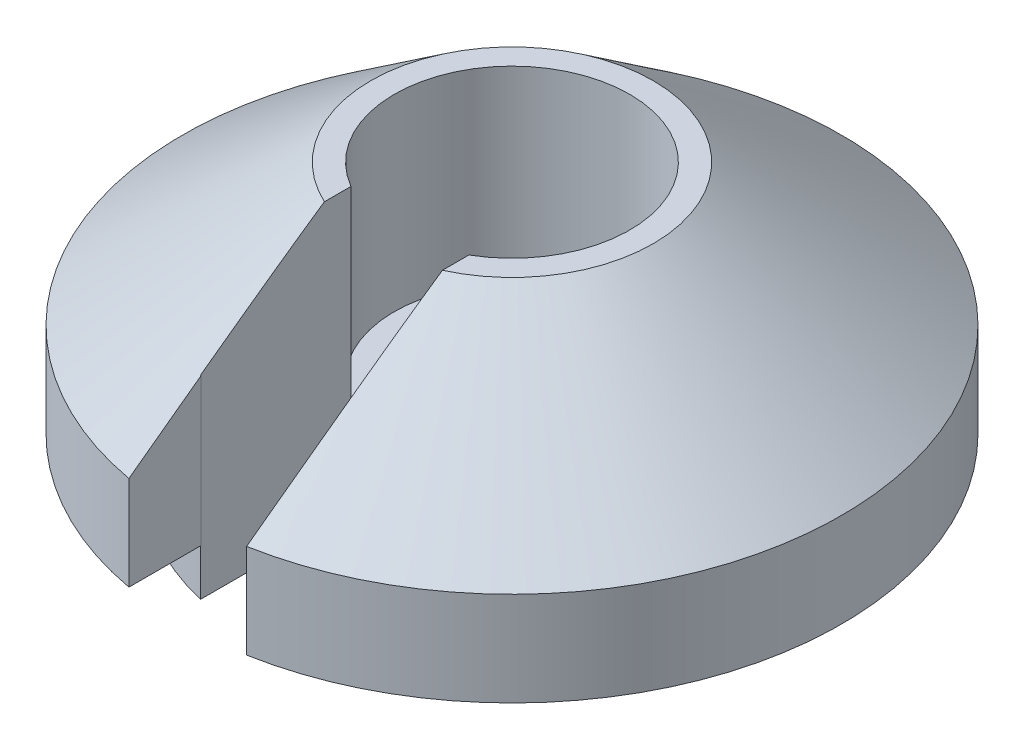
ISO-10303-21;
HEADER;
FILE_DESCRIPTION(('STEP AP214'),'2;1');
FILE_NAME('part.step','',(''),(''),'','','');
FILE_SCHEMA(('AUTOMOTIVE_DESIGN { 1 0 10303 214 1 1 1 1 }'));
ENDSEC;
DATA;
#1=APPLICATION_CONTEXT('core data for automotive mechanical design processes');
#2=APPLICATION_PROTOCOL_DEFINITION('international standard','automotive_design',2000,#1);
#3=PRODUCT_CONTEXT('',#1,'mechanical');
#4=PRODUCT('Part','Part','',(#3));
#5=PRODUCT_RELATED_PRODUCT_CATEGORY('part','',(#4));
#6=PRODUCT_DEFINITION_FORMATION('','',#4);
#7=PRODUCT_DEFINITION_CONTEXT('part definition',#1,'design');
#8=PRODUCT_DEFINITION('design','',#6,#7);
#9=PRODUCT_DEFINITION_SHAPE('','',#8);
#10=(LENGTH_UNIT() NAMED_UNIT(*) SI_UNIT(.MILLI.,.METRE.));
#11=(NAMED_UNIT(*) PLANE_ANGLE_UNIT() SI_UNIT($,.RADIAN.));
#12=(NAMED_UNIT(*) SI_UNIT($,.STERADIAN.) SOLID_ANGLE_UNIT());
#13=UNCERTAINTY_MEASURE_WITH_UNIT(LENGTH_MEASURE(1.E-05),#10,'distance_accuracy_value','');
#14=(GEOMETRIC_REPRESENTATION_CONTEXT(3) GLOBAL_UNCERTAINTY_ASSIGNED_CONTEXT((#13)) GLOBAL_UNIT_ASSIGNED_CONTEXT((#10,
#11,#12)) REPRESENTATION_CONTEXT('',''));
#15=CARTESIAN_POINT('',(0.,0.,0.));
#16=DIRECTION('',(0.,0.,1.));
#17=DIRECTION('',(1.,0.,0.));
#18=AXIS2_PLACEMENT_3D('',#15,#16,#17);
#19=CARTESIAN_POINT('',(0.,0.,0.));
#20=DIRECTION('',(0.,1.,0.));
#21=DIRECTION('',(-1.,0.,0.));
#22=AXIS2_PLACEMENT_3D('',#19,#20,#21);
#23=PLANE('',#22);
#24=DIRECTION('',(1.,0.,0.));
#25=VECTOR('',#24,1.);
#26=CARTESIAN_POINT('',(1.25,0.,-0.393928678592862));
#27=LINE('',#26,#25);
#28=CARTESIAN_POINT('',(1.24164617220011,0.,-0.393928678592862));
#29=VERTEX_POINT('',#28);
#30=CARTESIAN_POINT('',(1.25,0.,-0.393928678592862));
#31=VERTEX_POINT('',#30);
#32=EDGE_CURVE('E146',#29,#31,#27,.T.);
#33=ORIENTED_EDGE('',*,*,#32,.F.);
#34=CARTESIAN_POINT('',(-0.00739357909636663,0.,-0.393928678592863));
#35=DIRECTION('',(0.,-1.,0.));
#36=DIRECTION('',(1.,0.,0.));
#37=AXIS2_PLACEMENT_3D('',#34,#35,#36);
#38=CIRCLE('',#37,1.24903975129648);
#39=CARTESIAN_POINT('',(-1.25643333039284,0.,-0.393928678592863));
#40=VERTEX_POINT('',#39);
#41=EDGE_CURVE('E54',#40,#29,#38,.T.);
#42=ORIENTED_EDGE('',*,*,#41,.F.);
#43=CARTESIAN_POINT('',(-1.26478715819273,0.,-0.393928678592863));
#44=VERTEX_POINT('',#43);
#45=EDGE_CURVE('E145',#44,#40,#27,.T.);
#46=ORIENTED_EDGE('',*,*,#45,.F.);
#47=DIRECTION('',(0.,0.,-1.));
#48=VECTOR('',#47,1.);
#49=CARTESIAN_POINT('',(-1.26478715819273,0.,5.35607132140714));
#50=LINE('',#49,#48);
#51=CARTESIAN_POINT('',(-1.26478715819273,0.,5.35259875616235));
#52=VERTEX_POINT('',#51);
#53=EDGE_CURVE('E139',#52,#44,#50,.T.);
#54=ORIENTED_EDGE('',*,*,#53,.F.);
#55=CARTESIAN_POINT('',(0.,0.,0.));
#56=DIRECTION('',(0.,1.,0.));
#57=DIRECTION('',(-1.,0.,0.));
#58=AXIS2_PLACEMENT_3D('',#55,#56,#57);
#59=CIRCLE('',#58,5.5);
#60=CARTESIAN_POINT('',(1.25,0.,5.35607132140714));
#61=VERTEX_POINT('',#60);
#62=EDGE_CURVE('E290',#61,#52,#59,.T.);
#63=ORIENTED_EDGE('',*,*,#62,.F.);
#64=DIRECTION('',(0.,0.,1.));
#65=VECTOR('',#64,1.);
#66=CARTESIAN_POINT('',(1.25,0.,0.));
#67=LINE('',#66,#65);
#68=EDGE_CURVE('E61',#31,#61,#67,.T.);
#69=ORIENTED_EDGE('',*,*,#68,.F.);
#70=EDGE_LOOP('',(#33,#42,#46,#54,#63,#69));
#71=FACE_BOUND('',#70,.T.);
#72=ADVANCED_FACE('F40',(#71),#23,.F.);
#73=CARTESIAN_POINT('',(0.,6.,0.));
#74=DIRECTION('',(0.,1.,0.));
#75=DIRECTION('',(-1.,0.,0.));
#76=AXIS2_PLACEMENT_3D('',#73,#74,#75);
#77=CYLINDRICAL_SURFACE('',#76,5.5);
#78=ORIENTED_EDGE('',*,*,#62,.T.);
#79=DIRECTION('',(0.,1.,0.));
#80=VECTOR('',#79,1.);
#81=CARTESIAN_POINT('',(-1.26478715819274,6.,5.35259875616235));
#82=LINE('',#81,#80);
#83=CARTESIAN_POINT('',(-1.26478715819273,1.,5.35259875616235));
#84=VERTEX_POINT('',#83);
#85=EDGE_CURVE('E209',#52,#84,#82,.T.);
#86=ORIENTED_EDGE('',*,*,#85,.T.);
#87=CARTESIAN_POINT('',(0.,1.,0.));
#88=DIRECTION('',(0.,1.,0.));
#89=DIRECTION('',(-1.,0.,0.));
#90=AXIS2_PLACEMENT_3D('',#87,#88,#89);
#91=CIRCLE('',#90,5.5);
#92=CARTESIAN_POINT('',(1.25,1.,5.35607132140714));
#93=VERTEX_POINT('',#92);
#94=EDGE_CURVE('E288',#93,#84,#91,.T.);
#95=ORIENTED_EDGE('',*,*,#94,.F.);
#96=DIRECTION('',(0.,1.,0.));
#97=VECTOR('',#96,1.);
#98=CARTESIAN_POINT('',(1.25,6.,5.35607132140714));
#99=LINE('',#98,#97);
#100=EDGE_CURVE('E313',#61,#93,#99,.T.);
#101=ORIENTED_EDGE('',*,*,#100,.F.);
#102=EDGE_LOOP('',(#78,#86,#95,#101));
#103=FACE_BOUND('',#102,.T.);
#104=ADVANCED_FACE('F257',(#103),#77,.T.);
#105=CARTESIAN_POINT('',(5.5,1.,0.));
#106=DIRECTION('',(0.,1.,0.));
#107=DIRECTION('',(-1.,0.,0.));
#108=AXIS2_PLACEMENT_3D('',#105,#106,#107);
#109=PLANE('',#108);
#110=DIRECTION('',(0.,0.,1.));
#111=VECTOR('',#110,1.);
#112=CARTESIAN_POINT('',(-1.26478715819273,1.,0.));
#113=LINE('',#112,#111);
#114=CARTESIAN_POINT('',(-1.26478715819274,0.999999999999999,5.35607132140714));
#115=VERTEX_POINT('',#114);
#116=EDGE_CURVE('E179',#84,#115,#113,.T.);
#117=ORIENTED_EDGE('',*,*,#116,.T.);
#118=DIRECTION('',(1.,0.,0.));
#119=VECTOR('',#118,1.);
#120=CARTESIAN_POINT('',(5.5,1.,5.35607132140714));
#121=LINE('',#120,#119);
#122=CARTESIAN_POINT('',(-1.25,0.999999999999999,5.35607132140714));
#123=VERTEX_POINT('',#122);
#124=EDGE_CURVE('E208',#115,#123,#121,.T.);
#125=ORIENTED_EDGE('',*,*,#124,.T.);
#126=DIRECTION('',(0.,0.,-1.));
#127=VECTOR('',#126,1.);
#128=CARTESIAN_POINT('',(-1.25,1.,0.));
#129=LINE('',#128,#127);
#130=CARTESIAN_POINT('',(-1.25,0.999999999999999,6.88748865697796));
#131=VERTEX_POINT('',#130);
#132=EDGE_CURVE('E222',#131,#123,#129,.T.);
#133=ORIENTED_EDGE('',*,*,#132,.F.);
#134=CARTESIAN_POINT('',(0.,1.,0.));
#135=DIRECTION('',(0.,1.,0.));
#136=DIRECTION('',(-1.,0.,0.));
#137=AXIS2_PLACEMENT_3D('',#134,#135,#136);
#138=CIRCLE('',#137,7.);
#139=CARTESIAN_POINT('',(1.25,0.999999999999999,6.88748865697796));
#140=VERTEX_POINT('',#139);
#141=EDGE_CURVE('E278',#140,#131,#138,.T.);
#142=ORIENTED_EDGE('',*,*,#141,.F.);
#143=DIRECTION('',(0.,0.,1.));
#144=VECTOR('',#143,1.);
#145=CARTESIAN_POINT('',(1.25,1.,0.));
#146=LINE('',#145,#144);
#147=EDGE_CURVE('E282',#93,#140,#146,.T.);
#148=ORIENTED_EDGE('',*,*,#147,.F.);
#149=ORIENTED_EDGE('',*,*,#94,.T.);
#150=EDGE_LOOP('',(#117,#125,#133,#142,#148,#149));
#151=FACE_BOUND('',#150,.T.);
#152=ADVANCED_FACE('F261',(#151),#109,.F.);
#153=CARTESIAN_POINT('',(0.,6.,0.));
#154=DIRECTION('',(0.,1.,0.));
#155=DIRECTION('',(-1.,0.,0.));
#156=AXIS2_PLACEMENT_3D('',#153,#154,#155);
#157=CYLINDRICAL_SURFACE('',#156,7.);
#158=DIRECTION('',(0.,1.,0.));
#159=VECTOR('',#158,1.);
#160=CARTESIAN_POINT('',(1.25,6.,6.88748865697796));
#161=LINE('',#160,#159);
#162=CARTESIAN_POINT('',(1.25,3.,6.88748865697796));
#163=VERTEX_POINT('',#162);
#164=EDGE_CURVE('E234',#140,#163,#161,.T.);
#165=ORIENTED_EDGE('',*,*,#164,.F.);
#166=ORIENTED_EDGE('',*,*,#141,.T.);
#167=DIRECTION('',(0.,1.,0.));
#168=VECTOR('',#167,1.);
#169=CARTESIAN_POINT('',(-1.25,6.,6.88748865697796));
#170=LINE('',#169,#168);
#171=CARTESIAN_POINT('',(-1.25,3.,6.88748865697796));
#172=VERTEX_POINT('',#171);
#173=EDGE_CURVE('E220',#172,#131,#170,.F.);
#174=ORIENTED_EDGE('',*,*,#173,.F.);
#175=CARTESIAN_POINT('',(0.,3.,0.));
#176=DIRECTION('',(0.,1.,0.));
#177=DIRECTION('',(-1.,0.,0.));
#178=AXIS2_PLACEMENT_3D('',#175,#176,#177);
#179=CIRCLE('',#178,7.);
#180=EDGE_CURVE('E280',#163,#172,#179,.T.);
#181=ORIENTED_EDGE('',*,*,#180,.F.);
#182=EDGE_LOOP('',(#165,#166,#174,#181));
#183=FACE_BOUND('',#182,.T.);
#184=ADVANCED_FACE('F253',(#183),#157,.T.);
#185=CARTESIAN_POINT('',(0.,3.,0.));
#186=DIRECTION('',(0.,-1.,0.));
#187=DIRECTION('',(1.,0.,0.));
#188=AXIS2_PLACEMENT_3D('',#185,#186,#187);
#189=CONICAL_SURFACE('',#188,7.,0.927295218001612);
#190=CARTESIAN_POINT('',(5.16480782850736,2.66953933829889,5.35607132140714));
#191=CARTESIAN_POINT('',(5.16233796590271,2.6708251500734,5.35607132140714));
#192=CARTESIAN_POINT('',(5.15986790447759,2.67211059354893,5.35607132140714));
#193=CARTESIAN_POINT('',(4.84793666623998,2.83438281904356,5.3560713214071));
#194=CARTESIAN_POINT('',(4.53534966203854,2.98956968122107,5.35607132140713));
#195=CARTESIAN_POINT('',(4.06057524824004,3.20988833595827,5.35607132140714));
#196=CARTESIAN_POINT('',(3.90127507979419,3.28127492335229,5.35607132140714));
#197=CARTESIAN_POINT('',(3.58052365455789,3.41902542959078,5.35607132140714));
#198=CARTESIAN_POINT('',(3.41907263854709,3.48538990517751,5.35607132140714));
#199=CARTESIAN_POINT('',(3.09444605656343,3.61187336253272,5.35607132140714));
#200=CARTESIAN_POINT('',(2.93127953084735,3.67201542050914,5.35607132140714));
#201=CARTESIAN_POINT('',(2.60247582823034,3.78519727632324,5.35607132140714));
#202=CARTESIAN_POINT('',(2.43683853907877,3.83823675038048,5.35607132140714));
#203=CARTESIAN_POINT('',(2.10324707656866,3.93586288071713,5.35607132140714));
#204=CARTESIAN_POINT('',(1.93529541057563,3.98045801503021,5.35607132140714));
#205=CARTESIAN_POINT('',(1.59712410869283,4.05988814682739,5.35607132140714));
#206=CARTESIAN_POINT('',(1.4269049261672,4.09472506556162,5.35607132140714));
#207=CARTESIAN_POINT('',(1.0173697810613,4.16481585781404,5.35607132140714));
#208=CARTESIAN_POINT('',(0.777128387594338,4.19487834817586,5.35607132140714));
#209=CARTESIAN_POINT('',(0.294863862601688,4.23088598288171,5.35607132140714));
#210=CARTESIAN_POINT('',(0.0528411446024938,4.23683655814199,5.35607132140714));
#211=CARTESIAN_POINT('',(-0.430775043657437,4.22405782649338,5.35607132140714));
#212=CARTESIAN_POINT('',(-0.672367866595161,4.20530448575277,5.35607132140714));
#213=CARTESIAN_POINT('',(-1.15265070210179,4.14482498524738,5.35607132140714));
#214=CARTESIAN_POINT('',(-1.39133974271211,4.10309133858509,5.35607132140714));
#215=CARTESIAN_POINT('',(-1.93713952939652,3.98406511453776,5.35607132140714));
#216=CARTESIAN_POINT('',(-2.24270472608238,3.8997823662971,5.35607132140714));
#217=CARTESIAN_POINT('',(-2.84561037236499,3.70580734020737,5.35607132140714));
#218=CARTESIAN_POINT('',(-3.1429451965463,3.596098141247,5.35607132140714));
#219=CARTESIAN_POINT('',(-3.73065423255935,3.35806729416071,5.35607132140714));
#220=CARTESIAN_POINT('',(-4.02101284394659,3.22970777036636,5.35607132140714));
#221=CARTESIAN_POINT('',(-4.59531141882046,2.95974122058277,5.35607132140713));
#222=CARTESIAN_POINT('',(-4.87925369379799,2.81813906286983,5.35607132140712));
#223=CARTESIAN_POINT('',(-5.16695577590757,2.66842200679222,5.35607132140714));
#224=CARTESIAN_POINT('',(-5.1732760244337,2.66512990943619,5.35607132140714));
#225=CARTESIAN_POINT('',(-5.17959498670009,2.6618353972646,5.35607132140714));
#226=B_SPLINE_CURVE_WITH_KNOTS('',3,(#190,#191,#192,#193,#194,#195,#196,#197,#198,#199,#200,
#201,#202,#203,#204,#205,#206,#207,#208,#209,#210,#211,#212,#213,#214,#215,#216,#217,#218,#219,
#220,#221,#222,#223,#224,#225),.UNSPECIFIED.,.F.,.F.,(4,2,2,2,2,2,2,2,2,2,2,2,2,2,2,2,2,4),(0.,
0.00835356874901935,1.05484377970907,1.57847444564785,2.10204697753749,2.62360240895885,
3.14518160806733,3.66623433758661,4.18718440721029,4.91237884505285,5.63740993256659,
6.36314690617446,7.08912046218259,8.03847607456188,8.98846529936258,9.94041148026267,
10.8920090707672,10.913387818754),.UNSPECIFIED.);
#227=CARTESIAN_POINT('',(-1.25,4.125,5.35607132140714));
#228=VERTEX_POINT('',#227);
#229=CARTESIAN_POINT('',(-1.26478715819274,4.12246533176459,5.35607132140714));
#230=VERTEX_POINT('',#229);
#231=EDGE_CURVE('E202',#228,#230,#226,.T.);
#232=ORIENTED_EDGE('',*,*,#231,.T.);
#233=CARTESIAN_POINT('',(-1.26478715819274,1.24972572867472,9.24760785272899));
#234=CARTESIAN_POINT('',(-1.26478715819274,1.40589419849412,9.03744116356631));
#235=CARTESIAN_POINT('',(-1.26478715819274,1.5620029874933,8.82723008479648));
#236=CARTESIAN_POINT('',(-1.26478715819274,1.87424706431373,8.40644588897769));
#237=CARTESIAN_POINT('',(-1.26478715819274,2.03038216920434,8.19587263619277));
#238=CARTESIAN_POINT('',(-1.26478715819274,2.34497868103036,7.77118121424458));
#239=CARTESIAN_POINT('',(-1.26478715819274,2.50343693857667,7.5570607116724));
#240=CARTESIAN_POINT('',(-1.26478715819274,2.81991078098754,7.12888186283086));
#241=CARTESIAN_POINT('',(-1.26478715819274,2.97792666725763,6.91482373937762));
#242=CARTESIAN_POINT('',(-1.26478715819274,3.31579218007514,6.45638238239857));
#243=CARTESIAN_POINT('',(-1.26478715819274,3.49559160617839,6.211962139178));
#244=CARTESIAN_POINT('',(-1.26478715819274,3.85461840273908,5.72262715293433));
#245=CARTESIAN_POINT('',(-1.26478715819274,4.03384565304593,5.47771232168475));
#246=CARTESIAN_POINT('',(-1.26478715819274,4.39235813034786,4.98592976099489));
#247=CARTESIAN_POINT('',(-1.26478715819274,4.57163860892174,4.73905856828079));
#248=CARTESIAN_POINT('',(-1.26478715819274,4.92867397955666,4.24451449601917));
#249=CARTESIAN_POINT('',(-1.26478715819274,5.10642998292099,3.99684242121153));
#250=CARTESIAN_POINT('',(-1.26478715819273,5.36963957039906,3.62644367026652));
#251=CARTESIAN_POINT('',(-1.26478715819273,5.45597967122885,3.50434747146577));
#252=CARTESIAN_POINT('',(-1.26478715819273,5.62789814114846,3.25962043716468));
#253=CARTESIAN_POINT('',(-1.26478715819273,5.7134765143377,3.13698960454689));
#254=CARTESIAN_POINT('',(-1.26478715819273,5.88386060245493,2.89062221578338));
#255=CARTESIAN_POINT('',(-1.26478715819273,5.96866305983453,2.76688339993766));
#256=CARTESIAN_POINT('',(-1.26478715819273,6.09472988578843,2.5805311345985));
#257=CARTESIAN_POINT('',(-1.26478715819273,6.13655691556517,2.51829845930069));
#258=CARTESIAN_POINT('',(-1.26478715819273,6.21975479339185,2.39352091909093));
#259=CARTESIAN_POINT('',(-1.26478715819273,6.26112560119344,2.33097602733092));
#260=CARTESIAN_POINT('',(-1.26478715819273,6.3834910351225,2.14418052378367));
#261=CARTESIAN_POINT('',(-1.26478715819273,6.46367336696108,2.01939591039524));
#262=CARTESIAN_POINT('',(-1.26478715819273,6.62065528685359,1.76772049298706));
#263=CARTESIAN_POINT('',(-1.26478715819273,6.69745555891728,1.6408301220635));
#264=CARTESIAN_POINT('',(-1.26478715819273,6.80819313276322,1.44831799077451));
#265=CARTESIAN_POINT('',(-1.26478715819273,6.84428234609567,1.38393813385817));
#266=CARTESIAN_POINT('',(-1.26478715819273,6.91454824742828,1.25414701812201));
#267=CARTESIAN_POINT('',(-1.26478715819273,6.94872521035004,1.18873590930604));
#268=CARTESIAN_POINT('',(-1.26478715819273,7.01444686438135,1.05673406881415));
#269=CARTESIAN_POINT('',(-1.26478715819273,7.04599589306659,0.990145510093437));
#270=CARTESIAN_POINT('',(-1.26478715819273,7.10555386917442,0.855413132083905));
#271=CARTESIAN_POINT('',(-1.26478715819273,7.13356484663569,0.787270231378659));
#272=CARTESIAN_POINT('',(-1.26478715819273,7.16473555938788,0.703100311876969));
#273=CARTESIAN_POINT('',(-1.26478715819273,7.17022129500791,0.687927299742526));
#274=CARTESIAN_POINT('',(-1.26478715819273,7.18094133587439,0.657489472843603));
#275=CARTESIAN_POINT('',(-1.26478715819273,7.18617559454554,0.642224641658145));
#276=CARTESIAN_POINT('',(-1.26478715819273,7.20147579058755,0.596289054083686));
#277=CARTESIAN_POINT('',(-1.26478715819273,7.21113730370928,0.565482152036767));
#278=CARTESIAN_POINT('',(-1.26478715819273,7.22922170442241,0.503537142313185));
#279=CARTESIAN_POINT('',(-1.26478715819273,7.23764579168696,0.47239938723206));
#280=CARTESIAN_POINT('',(-1.26478715819273,7.25311094175666,0.409783516179736));
#281=CARTESIAN_POINT('',(-1.26478715819273,7.26015199230905,0.378305397195751));
#282=CARTESIAN_POINT('',(-1.26478715819273,7.27854784402159,0.285494141486036));
#283=CARTESIAN_POINT('',(-1.26478715819273,7.28779443568785,0.22372000851179));
#284=CARTESIAN_POINT('',(-1.26478715819273,7.29960106594782,0.0994894937709374));
#285=CARTESIAN_POINT('',(-1.26478715819273,7.30215752675738,0.0370327648820469));
#286=CARTESIAN_POINT('',(-1.26478715819273,7.30026569021268,-0.0887311665455935));
#287=CARTESIAN_POINT('',(-1.26478715819273,7.29570950822705,-0.152036743839124));
#288=CARTESIAN_POINT('',(-1.26478715819273,7.27991756515855,-0.27777750262966));
#289=CARTESIAN_POINT('',(-1.26478715819273,7.26868200208633,-0.340212709872686));
#290=CARTESIAN_POINT('',(-1.26478715819273,7.24041255230464,-0.464672707178442));
#291=CARTESIAN_POINT('',(-1.26478715819273,7.223297143778,-0.526678496868802));
#292=CARTESIAN_POINT('',(-1.26478715819273,7.18454732899135,-0.649242893207944));
#293=CARTESIAN_POINT('',(-1.26478715819273,7.16291205349011,-0.709801218986593));
#294=CARTESIAN_POINT('',(-1.26478715819273,7.10251700451765,-0.864737058172624));
#295=CARTESIAN_POINT('',(-1.26478715819273,7.06116178369979,-0.958091861881416));
#296=CARTESIAN_POINT('',(-1.26478715819273,6.97295216046218,-1.14219353036344));
#297=CARTESIAN_POINT('',(-1.26478715819273,6.92609266631065,-1.2329378822074));
#298=CARTESIAN_POINT('',(-1.26478715819273,6.82865216706877,-1.41268951025882));
#299=CARTESIAN_POINT('',(-1.26478715819273,6.77806194980396,-1.50169174977936));
#300=CARTESIAN_POINT('',(-1.26478715819273,6.67445148095171,-1.67821171315831));
#301=CARTESIAN_POINT('',(-1.26478715819273,6.62143216989875,-1.76572999391324));
#302=CARTESIAN_POINT('',(-1.26478715819273,6.51345430886805,-1.94004790211301));
#303=CARTESIAN_POINT('',(-1.26478715819273,6.45848878013761,-2.02684318870678));
#304=CARTESIAN_POINT('',(-1.26478715819273,6.34729175157858,-2.19962636061017));
#305=CARTESIAN_POINT('',(-1.26478715819273,6.29106014633629,-2.28561417783882));
#306=CARTESIAN_POINT('',(-1.26478715819273,6.12115047928665,-2.54239188289991));
#307=CARTESIAN_POINT('',(-1.26478715819273,6.0060881351068,-2.7122645158082));
#308=CARTESIAN_POINT('',(-1.26478715819273,5.80845151353477,-3.00002320736555));
#309=CARTESIAN_POINT('',(-1.26478715819273,5.72643080405517,-3.11829266891371));
#310=CARTESIAN_POINT('',(-1.26478715819273,5.56155572775621,-3.35432172982757));
#311=CARTESIAN_POINT('',(-1.26478715819273,5.47870103307081,-3.47208110038411));
#312=CARTESIAN_POINT('',(-1.26478715819273,5.31324531016191,-3.70598201076143));
#313=CARTESIAN_POINT('',(-1.26478715819273,5.23065029426069,-3.82212781194067));
#314=CARTESIAN_POINT('',(-1.26478715819273,5.06503946690477,-4.05404393782353));
#315=CARTESIAN_POINT('',(-1.26478715819273,4.982023851116,-4.16981440219942));
#316=CARTESIAN_POINT('',(-1.26478715819273,4.89884266644093,-4.28546520991472));
#317=B_SPLINE_CURVE_WITH_KNOTS('',3,(#233,#234,#235,#236,#237,#238,#239,#240,#241,#242,#243,
#244,#245,#246,#247,#248,#249,#250,#251,#252,#253,#254,#255,#256,#257,#258,#259,#260,#261,#262,
#263,#264,#265,#266,#267,#268,#269,#270,#271,#272,#273,#274,#275,#276,#277,#278,#279,#280,#281,
#282,#283,#284,#285,#286,#287,#288,#289,#290,#291,#292,#293,#294,#295,#296,#297,#298,#299,#300,
#301,#302,#303,#304,#305,#306,#307,#308,#309,#310,#311,#312,#313,#314,#315,#316),.UNSPECIFIED.,
.F.,.F.,(4,2,2,2,2,2,2,2,2,2,2,2,2,2,2,2,2,2,2,2,2,2,2,2,2,2,2,2,2,2,2,2,2,2,2,2,2,2,2,2,2,4),
(0.,0.785511118452694,1.57194183407273,2.37107213741403,3.16926304663273,4.07954910519125,
4.9900151664754,5.90531716795177,6.81988280683116,7.26849948666661,7.71711375069641,
8.16713242603929,8.39207886811178,8.61704499892759,9.06199462352726,9.50685384140687,
9.72824673742326,9.94960772186695,10.1705957804354,10.3914564603766,10.4398574864399,
10.4882674424292,10.5851031885127,10.6818444246581,10.7785865178261,10.9656304271243,
11.1527743443486,11.3427845594244,11.5327891419166,11.7255421390479,11.9183322397809,
12.2243317546205,12.5306165973946,12.8376848436259,13.1446351829301,13.4528275498695,
13.7610456725401,14.3765297145262,14.8083097564788,15.2402667461084,15.6678239382514,
16.0951977572699),.UNSPECIFIED.);
#318=CARTESIAN_POINT('',(-1.26478715819273,6.,2.72035171337655));
#319=VERTEX_POINT('',#318);
#320=EDGE_CURVE('E170',#230,#319,#317,.T.);
#321=ORIENTED_EDGE('',*,*,#320,.T.);
#322=CARTESIAN_POINT('',(0.,6.,0.));
#323=DIRECTION('',(0.,1.,0.));
#324=DIRECTION('',(-1.,0.,0.));
#325=AXIS2_PLACEMENT_3D('',#322,#323,#324);
#326=CIRCLE('',#325,3.);
#327=CARTESIAN_POINT('',(1.25,6.,2.72717802865893));
#328=VERTEX_POINT('',#327);
#329=EDGE_CURVE('E292',#328,#319,#326,.T.);
#330=ORIENTED_EDGE('',*,*,#329,.F.);
#331=CARTESIAN_POINT('',(1.25,-0.477745260207604,11.5696638635183));
#332=CARTESIAN_POINT('',(1.25,-0.248324844561364,11.2619840800091));
#333=CARTESIAN_POINT('',(1.25,-0.0189670458171195,10.9542575617158));
#334=CARTESIAN_POINT('',(1.25,0.439719038379632,10.338478457238));
#335=CARTESIAN_POINT('',(1.25,0.669047212475785,10.0304257881101));
#336=CARTESIAN_POINT('',(1.25,1.12958766566294,9.41131677022536));
#337=CARTESIAN_POINT('',(1.25,1.36079786006554,9.10025887045549));
#338=CARTESIAN_POINT('',(1.25,1.82276138806421,8.47811012627396));
#339=CARTESIAN_POINT('',(1.25,2.05351491846949,8.16701942803119));
#340=CARTESIAN_POINT('',(1.25,2.49104911476336,7.57630158557573));
#341=CARTESIAN_POINT('',(1.25,2.69787159805271,7.29670542409756));
#342=CARTESIAN_POINT('',(1.25,3.11105109216446,6.73712728560482));
#343=CARTESIAN_POINT('',(1.25,3.31740805578801,6.45714527372997));
#344=CARTESIAN_POINT('',(1.25,3.72993952767342,5.89595692072733));
#345=CARTESIAN_POINT('',(1.25,3.93611226045465,5.61474927309335));
#346=CARTESIAN_POINT('',(1.25,4.34729412092714,5.05164953217443));
#347=CARTESIAN_POINT('',(1.25,4.55230366437463,4.76975774258541));
#348=CARTESIAN_POINT('',(1.25,4.95866411616229,4.20734352201211));
#349=CARTESIAN_POINT('',(1.25,5.1600313113835,3.92683290675218));
#350=CARTESIAN_POINT('',(1.25,5.45986643599669,3.50417828920731));
#351=CARTESIAN_POINT('',(1.25,5.55951539136721,3.3628729720256));
#352=CARTESIAN_POINT('',(1.25,5.75766597226955,3.07948463840566));
#353=CARTESIAN_POINT('',(1.25,5.85616774143942,2.93740172267678));
#354=CARTESIAN_POINT('',(1.25,6.05097151950758,2.65286677828212));
#355=CARTESIAN_POINT('',(1.25,6.14728257395673,2.51042095195042));
#356=CARTESIAN_POINT('',(1.25,6.33741778663091,2.22375854660094));
#357=CARTESIAN_POINT('',(1.25,6.43124065855526,2.07954110599443));
#358=CARTESIAN_POINT('',(1.25,6.56864810741901,1.86137130299382));
#359=CARTESIAN_POINT('',(1.25,6.61384113189937,1.78843402888986));
#360=CARTESIAN_POINT('',(1.25,6.70278717519524,1.64168882855792));
#361=CARTESIAN_POINT('',(1.25,6.74654029055172,1.56788096115281));
#362=CARTESIAN_POINT('',(1.25,6.83205426653258,1.41919780862435));
#363=CARTESIAN_POINT('',(1.25,6.87381675806319,1.34432346493989));
#364=CARTESIAN_POINT('',(1.25,6.95460309322864,1.19311723667167));
#365=CARTESIAN_POINT('',(1.25,6.99362776732572,1.11678580308205));
#366=CARTESIAN_POINT('',(1.25,7.0378632573971,1.0245370113301));
#367=CARTESIAN_POINT('',(1.25,7.04497076273895,1.00952528158523));
#368=CARTESIAN_POINT('',(1.25,7.05902566056188,0.979425593056914));
#369=CARTESIAN_POINT('',(1.25,7.0659730405582,0.964337628440595));
#370=CARTESIAN_POINT('',(1.25,7.08655787728188,0.91895395012895));
#371=CARTESIAN_POINT('',(1.25,7.0999370700851,0.888540447811447));
#372=CARTESIAN_POINT('',(1.25,7.125896192744,0.827376850606679));
#373=CARTESIAN_POINT('',(1.25,7.13847621377118,0.796626794585203));
#374=CARTESIAN_POINT('',(1.25,7.16271100623725,0.734764811861036));
#375=CARTESIAN_POINT('',(1.25,7.17436576977778,0.703652882071848));
#376=CARTESIAN_POINT('',(1.25,7.20734483811424,0.610830782995699));
#377=CARTESIAN_POINT('',(1.25,7.22714736254097,0.54856478576018));
#378=CARTESIAN_POINT('',(1.25,7.26136364618984,0.422540400338123));
#379=CARTESIAN_POINT('',(1.25,7.2757783222631,0.358782268032505));
#380=CARTESIAN_POINT('',(1.25,7.29551421006001,0.244012056013647));
#381=CARTESIAN_POINT('',(1.25,7.30212764513425,0.193224456668963));
#382=CARTESIAN_POINT('',(1.25,7.31077077399093,0.091270818790859));
#383=CARTESIAN_POINT('',(1.25,7.31280233196053,0.0401049426675927));
#384=CARTESIAN_POINT('',(1.25,7.31212447289816,-0.062195238284639));
#385=CARTESIAN_POINT('',(1.25,7.30941502289258,-0.113329542891551));
#386=CARTESIAN_POINT('',(1.25,7.2994684204692,-0.215160152740109));
#387=CARTESIAN_POINT('',(1.25,7.29222975522943,-0.265856305894695));
#388=CARTESIAN_POINT('',(1.25,7.26966096675416,-0.388563362988002));
#389=CARTESIAN_POINT('',(1.25,7.25217482762305,-0.460175754766652));
#390=CARTESIAN_POINT('',(1.25,7.21075714437361,-0.601496862658327));
#391=CARTESIAN_POINT('',(1.25,7.18682067786357,-0.671204079957222));
#392=CARTESIAN_POINT('',(1.25,7.1337926701371,-0.809997718497378));
#393=CARTESIAN_POINT('',(1.25,7.1046183362459,-0.879051992153568));
#394=CARTESIAN_POINT('',(1.25,7.05824588135761,-0.981413863072158));
#395=CARTESIAN_POINT('',(1.25,7.0423553456526,-1.01532714684989));
#396=CARTESIAN_POINT('',(1.25,7.00982738910386,-1.08279237705778));
#397=CARTESIAN_POINT('',(1.25,6.99319000304152,-1.11634434022487));
#398=CARTESIAN_POINT('',(1.25,6.93471932121328,-1.23151490621473));
#399=CARTESIAN_POINT('',(1.25,6.89131040878636,-1.31233337820989));
#400=CARTESIAN_POINT('',(1.25,6.80189953091848,-1.47252901717974));
#401=CARTESIAN_POINT('',(1.25,6.75589693758847,-1.55190582894908));
#402=CARTESIAN_POINT('',(1.25,6.66201987070183,-1.70961714206718));
#403=CARTESIAN_POINT('',(1.25,6.61414408972076,-1.78795086235181));
#404=CARTESIAN_POINT('',(1.25,6.51704380777682,-1.94377974161025));
#405=CARTESIAN_POINT('',(1.25,6.46781923656123,-2.02127485661033));
#406=CARTESIAN_POINT('',(1.25,6.31836554373436,-2.25324301506088));
#407=CARTESIAN_POINT('',(1.25,6.21663239502315,-2.40674524397082));
#408=CARTESIAN_POINT('',(1.25,6.01084593242066,-2.71207692548172));
#409=CARTESIAN_POINT('',(1.25,5.90679363281521,-2.86390706758865));
#410=CARTESIAN_POINT('',(1.25,5.71120887287259,-3.14620445747736));
#411=CARTESIAN_POINT('',(1.25,5.61986919355058,-3.27680545900673));
#412=CARTESIAN_POINT('',(1.25,5.43635187059788,-3.53744159026063));
#413=CARTESIAN_POINT('',(1.25,5.34417412056497,-3.66747664494333));
#414=CARTESIAN_POINT('',(1.25,5.15972085571404,-3.92639813222052));
#415=CARTESIAN_POINT('',(1.25,5.06744867931179,-4.05528694553734));
#416=CARTESIAN_POINT('',(1.25,4.88245299912959,-4.31271167667867));
#417=CARTESIAN_POINT('',(1.25,4.78972956364421,-4.44124764356441));
#418=CARTESIAN_POINT('',(1.25,4.69684163006076,-4.56966386351835));
#419=B_SPLINE_CURVE_WITH_KNOTS('',3,(#331,#332,#333,#334,#335,#336,#337,#338,#339,#340,#341,
#342,#343,#344,#345,#346,#347,#348,#349,#350,#351,#352,#353,#354,#355,#356,#357,#358,#359,#360,
#361,#362,#363,#364,#365,#366,#367,#368,#369,#370,#371,#372,#373,#374,#375,#376,#377,#378,#379,
#380,#381,#382,#383,#384,#385,#386,#387,#388,#389,#390,#391,#392,#393,#394,#395,#396,#397,#398,
#399,#400,#401,#402,#403,#404,#405,#406,#407,#408,#409,#410,#411,#412,#413,#414,#415,#416,#417,
#418),.UNSPECIFIED.,.F.,.F.,(4,2,2,2,2,2,2,2,2,2,2,2,2,2,2,2,2,2,2,2,2,2,2,2,2,2,2,2,2,2,2,2,2,
2,2,2,2,2,2,2,2,2,2,4),(0.,1.15139276209653,2.30351713443965,3.46624505412195,4.6282351233332,
5.67156880750589,6.71500390558543,7.76107293267568,8.80674096293145,9.84263855427342,
10.3613585135446,10.8800128106223,11.3958484422175,11.9119457397151,12.1693450898708,
12.4267271469766,12.6838945744669,12.9409836550292,12.9908108153326,13.0406418475451,
13.1403105554917,13.2399678724878,13.3396260401062,13.5354518565644,13.7312443341204,
13.8847069236265,14.0381070639162,14.1915082711051,14.3449607438404,14.5656826286488,
14.7865734306993,15.0113251873806,15.1236735198011,15.2360166254921,15.511151645929,
15.7863535605922,16.0617511092169,16.3371630294919,16.8895791973483,17.4417583300487,
17.9198709128062,18.3980450692321,18.8735839681956,19.3490530071223),.UNSPECIFIED.);
#420=EDGE_CURVE('E228',#163,#328,#419,.T.);
#421=ORIENTED_EDGE('',*,*,#420,.F.);
#422=ORIENTED_EDGE('',*,*,#180,.T.);
#423=CARTESIAN_POINT('',(-1.25,4.69684163006076,-4.56966386351835));
#424=CARTESIAN_POINT('',(-1.25,4.80743418236203,-4.41675494290164));
#425=CARTESIAN_POINT('',(-1.25,4.91780507110536,-4.26368384402585));
#426=CARTESIAN_POINT('',(-1.25,5.13786093049608,-3.9570288255151));
#427=CARTESIAN_POINT('',(-1.25,5.24754583855776,-3.80344486099427));
#428=CARTESIAN_POINT('',(-1.25,5.46528064916918,-3.49657065574051));
#429=CARTESIAN_POINT('',(-1.25,5.57333649532822,-3.34328463754822));
#430=CARTESIAN_POINT('',(-1.25,5.78808083258378,-3.03576536183218));
#431=CARTESIAN_POINT('',(-1.25,5.89476938953966,-2.88153215046605));
#432=CARTESIAN_POINT('',(-1.25,6.06682283154799,-2.62916116456845));
#433=CARTESIAN_POINT('',(-1.25,6.13282337788821,-2.53145729632624));
#434=CARTESIAN_POINT('',(-1.25,6.26369135646699,-2.33529454317341));
#435=CARTESIAN_POINT('',(-1.25,6.32855881341665,-2.23683567479585));
#436=CARTESIAN_POINT('',(-1.25,6.45706402578883,-2.0383584612281));
#437=CARTESIAN_POINT('',(-1.25,6.52069322881021,-1.93833456067341));
#438=CARTESIAN_POINT('',(-1.25,6.6456357090332,-1.73686466250215));
#439=CARTESIAN_POINT('',(-1.25,6.70694941031709,-1.63541893000541));
#440=CARTESIAN_POINT('',(-1.25,6.8167581123834,-1.44649971999265));
#441=CARTESIAN_POINT('',(-1.25,6.86575837901864,-1.35932184670528));
#442=CARTESIAN_POINT('',(-1.25,6.96010531392046,-1.18290115257994));
#443=CARTESIAN_POINT('',(-1.25,7.00544932007154,-1.09365688698443));
#444=CARTESIAN_POINT('',(-1.25,7.09023719623729,-0.913042255868215));
#445=CARTESIAN_POINT('',(-1.25,7.12971599186983,-0.821688555920202));
#446=CARTESIAN_POINT('',(-1.25,7.19995220522687,-0.635685159520958));
#447=CARTESIAN_POINT('',(-1.25,7.23072363587921,-0.541041037276831));
#448=CARTESIAN_POINT('',(-1.25,7.26876542111803,-0.389695281622411));
#449=CARTESIAN_POINT('',(-1.25,7.28045577557461,-0.334116112429872));
#450=CARTESIAN_POINT('',(-1.25,7.29869583991633,-0.222114884369398));
#451=CARTESIAN_POINT('',(-1.25,7.30524723493875,-0.165693107993858));
#452=CARTESIAN_POINT('',(-1.25,7.31260900131717,-0.0527466654294678));
#453=CARTESIAN_POINT('',(-1.25,7.31344765563278,0.00377610601702359));
#454=CARTESIAN_POINT('',(-1.25,7.30937940961377,0.116617529406604));
#455=CARTESIAN_POINT('',(-1.25,7.30447134674913,0.172936137736392));
#456=CARTESIAN_POINT('',(-1.25,7.28763626177973,0.297555027349939));
#457=CARTESIAN_POINT('',(-1.25,7.27436841742971,0.365671897888745));
#458=CARTESIAN_POINT('',(-1.25,7.24133167080641,0.500298236745567));
#459=CARTESIAN_POINT('',(-1.25,7.22155846390104,0.566806609345027));
#460=CARTESIAN_POINT('',(-1.25,7.17684119572276,0.698876725567143));
#461=CARTESIAN_POINT('',(-1.25,7.15184068340733,0.764418996064872));
#462=CARTESIAN_POINT('',(-1.25,7.11156963907147,0.861548969669365));
#463=CARTESIAN_POINT('',(-1.25,7.09768549156228,0.893725810154962));
#464=CARTESIAN_POINT('',(-1.25,7.06911990471506,0.957722660166539));
#465=CARTESIAN_POINT('',(-1.25,7.05443849978575,0.989542685020876));
#466=CARTESIAN_POINT('',(-1.25,7.00727135083473,1.0889517432827));
#467=CARTESIAN_POINT('',(-1.25,6.97356892365613,1.1559634155018));
#468=CARTESIAN_POINT('',(-1.25,6.90390642012633,1.28880808360998));
#469=CARTESIAN_POINT('',(-1.25,6.86794582444886,1.35464080386066));
#470=CARTESIAN_POINT('',(-1.25,6.79432859268907,1.48540973848449));
#471=CARTESIAN_POINT('',(-1.25,6.75667075326257,1.55034527274104));
#472=CARTESIAN_POINT('',(-1.25,6.6800879147937,1.67946654355169));
#473=CARTESIAN_POINT('',(-1.25,6.64116284039518,1.74365223520686));
#474=CARTESIAN_POINT('',(-1.25,6.52275781759865,1.93561694718357));
#475=CARTESIAN_POINT('',(-1.25,6.4418241863613,2.06249778341493));
#476=CARTESIAN_POINT('',(-1.25,6.27760345850704,2.31463519085081));
#477=CARTESIAN_POINT('',(-1.25,6.19431737816982,2.43989243035046));
#478=CARTESIAN_POINT('',(-1.25,6.02615024326112,2.6893305784751));
#479=CARTESIAN_POINT('',(-1.25,5.94126918052461,2.81351148158536));
#480=CARTESIAN_POINT('',(-1.25,5.77038883683895,3.06111855926775));
#481=CARTESIAN_POINT('',(-1.25,5.68438943997106,3.18454465362045));
#482=CARTESIAN_POINT('',(-1.25,5.42547604497861,3.55360954121891));
#483=CARTESIAN_POINT('',(-1.25,5.25138358483759,3.79842060864549));
#484=CARTESIAN_POINT('',(-1.25,4.84797135201184,4.36141457384946));
#485=CARTESIAN_POINT('',(-1.25,4.61803482828304,4.67915370818081));
#486=CARTESIAN_POINT('',(-1.25,4.15652456188677,5.31344867698143));
#487=CARTESIAN_POINT('',(-1.25,3.92495078518246,5.63000448664018));
#488=CARTESIAN_POINT('',(-1.25,3.46065244380315,6.26259664823299));
#489=CARTESIAN_POINT('',(-1.25,3.22792721218736,6.57863251017853));
#490=CARTESIAN_POINT('',(-1.25,2.761830841121,7.21022358793633));
#491=CARTESIAN_POINT('',(-1.25,2.52845970660479,7.52577880739204));
#492=CARTESIAN_POINT('',(-1.25,2.06432953135419,8.15243217165684));
#493=CARTESIAN_POINT('',(-1.25,1.83357627479994,8.46353460198078));
#494=CARTESIAN_POINT('',(-1.25,1.3717576365817,9.08550887472469));
#495=CARTESIAN_POINT('',(-1.25,1.14069225413357,9.39638071656231));
#496=CARTESIAN_POINT('',(-1.25,0.678497600771915,10.017729227249));
#497=CARTESIAN_POINT('',(-1.25,0.447368495673506,10.3282060194625));
#498=CARTESIAN_POINT('',(-1.25,-0.015067629810961,10.949025649481));
#499=CARTESIAN_POINT('',(-1.25,-0.246374649665427,11.2593684876819));
#500=CARTESIAN_POINT('',(-1.25,-0.477745260207603,11.5696638635183));
#501=B_SPLINE_CURVE_WITH_KNOTS('',3,(#423,#424,#425,#426,#427,#428,#429,#430,#431,#432,#433,
#434,#435,#436,#437,#438,#439,#440,#441,#442,#443,#444,#445,#446,#447,#448,#449,#450,#451,#452,
#453,#454,#455,#456,#457,#458,#459,#460,#461,#462,#463,#464,#465,#466,#467,#468,#469,#470,#471,
#472,#473,#474,#475,#476,#477,#478,#479,#480,#481,#482,#483,#484,#485,#486,#487,#488,#489,#490,
#491,#492,#493,#494,#495,#496,#497,#498,#499,#500),.UNSPECIFIED.,.F.,.F.,(4,2,2,2,2,2,2,2,2,2,2,
2,2,2,2,2,2,2,2,2,2,2,2,2,2,2,2,2,2,2,2,2,2,2,2,2,2,2,4),(0.,0.566135217345018,1.13232135403342,
1.69494837448663,2.25754819177561,2.6112644945809,2.96497307366994,3.32059543017136,
3.67615233569031,3.9761120573891,4.27628824324405,4.57459839875131,4.87242571170707,
5.04261332310822,5.21274510423436,5.38203397118499,5.55135709028174,5.75913161783112,
5.96704390831458,6.17732961595822,6.28245530581299,6.38757646216321,6.6125378134902,
6.83755109152782,7.0627264936777,7.28791531043419,7.73935114671514,8.1905948547217,
8.64184087336239,9.09313404387176,9.99431965157935,11.1709425132483,12.3475899080679,
13.525025469509,14.7024520606412,15.864469913185,17.0264906904222,18.1876747214903,
19.3488552964305),.UNSPECIFIED.);
#502=EDGE_CURVE('E214',#228,#172,#501,.T.);
#503=ORIENTED_EDGE('',*,*,#502,.F.);
#504=EDGE_LOOP('',(#232,#321,#330,#421,#422,#503));
#505=FACE_BOUND('',#504,.T.);
#506=ADVANCED_FACE('F181',(#505),#189,.T.);
#507=CARTESIAN_POINT('',(3.,6.,0.));
#508=DIRECTION('',(0.,-1.,0.));
#509=DIRECTION('',(1.,0.,0.));
#510=AXIS2_PLACEMENT_3D('',#507,#508,#509);
#511=PLANE('',#510);
#512=ORIENTED_EDGE('',*,*,#329,.T.);
#513=DIRECTION('',(0.,0.,-1.));
#514=VECTOR('',#513,1.);
#515=CARTESIAN_POINT('',(-1.26478715819273,6.,0.));
#516=LINE('',#515,#514);
#517=CARTESIAN_POINT('',(-1.26478715819273,6.,2.15645854225643));
#518=VERTEX_POINT('',#517);
#519=EDGE_CURVE('E167',#319,#518,#516,.T.);
#520=ORIENTED_EDGE('',*,*,#519,.T.);
#521=CARTESIAN_POINT('',(0.,6.,0.));
#522=DIRECTION('',(0.,1.,0.));
#523=DIRECTION('',(-1.,0.,0.));
#524=AXIS2_PLACEMENT_3D('',#521,#522,#523);
#525=CIRCLE('',#524,2.5);
#526=CARTESIAN_POINT('',(1.25,6.,2.1650635094611));
#527=VERTEX_POINT('',#526);
#528=EDGE_CURVE('E307',#527,#518,#525,.T.);
#529=ORIENTED_EDGE('',*,*,#528,.F.);
#530=DIRECTION('',(0.,0.,-1.));
#531=VECTOR('',#530,1.);
#532=CARTESIAN_POINT('',(1.25,6.,0.));
#533=LINE('',#532,#531);
#534=EDGE_CURVE('E212',#328,#527,#533,.T.);
#535=ORIENTED_EDGE('',*,*,#534,.F.);
#536=EDGE_LOOP('',(#512,#520,#529,#535));
#537=FACE_BOUND('',#536,.T.);
#538=ADVANCED_FACE('F246',(#537),#511,.F.);
#539=CARTESIAN_POINT('',(0.,2.,0.));
#540=DIRECTION('',(0.,1.,0.));
#541=DIRECTION('',(-1.,0.,0.));
#542=AXIS2_PLACEMENT_3D('',#539,#540,#541);
#543=CYLINDRICAL_SURFACE('',#542,2.5);
#544=ORIENTED_EDGE('',*,*,#528,.T.);
#545=DIRECTION('',(0.,1.,0.));
#546=VECTOR('',#545,1.);
#547=CARTESIAN_POINT('',(-1.26478715819273,2.,2.15645854225643));
#548=LINE('',#547,#546);
#549=CARTESIAN_POINT('',(-1.26478715819273,2.,2.15645854225643));
#550=VERTEX_POINT('',#549);
#551=EDGE_CURVE('E164',#518,#550,#548,.F.);
#552=ORIENTED_EDGE('',*,*,#551,.T.);
#553=CARTESIAN_POINT('',(0.,2.,0.));
#554=DIRECTION('',(0.,1.,0.));
#555=DIRECTION('',(-1.,0.,0.));
#556=AXIS2_PLACEMENT_3D('',#553,#554,#555);
#557=CIRCLE('',#556,2.5);
#558=CARTESIAN_POINT('',(1.25,2.,2.1650635094611));
#559=VERTEX_POINT('',#558);
#560=EDGE_CURVE('E305',#559,#550,#557,.T.);
#561=ORIENTED_EDGE('',*,*,#560,.F.);
#562=DIRECTION('',(0.,1.,0.));
#563=VECTOR('',#562,1.);
#564=CARTESIAN_POINT('',(1.25,2.,2.1650635094611));
#565=LINE('',#564,#563);
#566=EDGE_CURVE('E225',#527,#559,#565,.F.);
#567=ORIENTED_EDGE('',*,*,#566,.F.);
#568=EDGE_LOOP('',(#544,#552,#561,#567));
#569=FACE_BOUND('',#568,.T.);
#570=ADVANCED_FACE('F243',(#569),#543,.F.);
#571=CARTESIAN_POINT('',(0.,2.,0.));
#572=DIRECTION('',(0.,1.,0.));
#573=DIRECTION('',(-1.,0.,0.));
#574=AXIS2_PLACEMENT_3D('',#571,#572,#573);
#575=PLANE('',#574);
#576=CARTESIAN_POINT('',(-0.00739357909636675,2.,-0.393928678592863));
#577=DIRECTION('',(0.,1.,0.));
#578=DIRECTION('',(-1.,0.,0.));
#579=AXIS2_PLACEMENT_3D('',#576,#577,#578);
#580=CIRCLE('',#579,1.24903975129648);
#581=CARTESIAN_POINT('',(1.24164617220011,2.,-0.393928678592862));
#582=VERTEX_POINT('',#581);
#583=CARTESIAN_POINT('',(-1.25643333039284,2.,-0.393928678592863));
#584=VERTEX_POINT('',#583);
#585=EDGE_CURVE('E135',#582,#584,#580,.T.);
#586=ORIENTED_EDGE('',*,*,#585,.F.);
#587=DIRECTION('',(-1.,0.,0.));
#588=VECTOR('',#587,1.);
#589=CARTESIAN_POINT('',(0.,2.,-0.393928678592863));
#590=LINE('',#589,#588);
#591=CARTESIAN_POINT('',(1.25,2.,-0.393928678592862));
#592=VERTEX_POINT('',#591);
#593=EDGE_CURVE('E163',#592,#582,#590,.T.);
#594=ORIENTED_EDGE('',*,*,#593,.F.);
#595=DIRECTION('',(0.,0.,1.));
#596=VECTOR('',#595,1.);
#597=CARTESIAN_POINT('',(1.25,2.,0.));
#598=LINE('',#597,#596);
#599=EDGE_CURVE('E297',#592,#559,#598,.T.);
#600=ORIENTED_EDGE('',*,*,#599,.T.);
#601=ORIENTED_EDGE('',*,*,#560,.T.);
#602=DIRECTION('',(0.,0.,1.));
#603=VECTOR('',#602,1.);
#604=CARTESIAN_POINT('',(-1.26478715819273,2.,0.));
#605=LINE('',#604,#603);
#606=CARTESIAN_POINT('',(-1.26478715819273,2.,-0.393928678592863));
#607=VERTEX_POINT('',#606);
#608=EDGE_CURVE('E47',#607,#550,#605,.T.);
#609=ORIENTED_EDGE('',*,*,#608,.F.);
#610=EDGE_CURVE('E160',#584,#607,#590,.T.);
#611=ORIENTED_EDGE('',*,*,#610,.F.);
#612=EDGE_LOOP('',(#586,#594,#600,#601,#609,#611));
#613=FACE_BOUND('',#612,.T.);
#614=ADVANCED_FACE('F240',(#613),#575,.T.);
#615=CARTESIAN_POINT('',(1.25,6.,0.));
#616=DIRECTION('',(-1.,0.,0.));
#617=DIRECTION('',(0.,0.,1.));
#618=AXIS2_PLACEMENT_3D('',#615,#616,#617);
#619=PLANE('',#618);
#620=ORIENTED_EDGE('',*,*,#420,.T.);
#621=ORIENTED_EDGE('',*,*,#534,.T.);
#622=ORIENTED_EDGE('',*,*,#566,.T.);
#623=ORIENTED_EDGE('',*,*,#599,.F.);
#624=DIRECTION('',(0.,-1.,0.));
#625=VECTOR('',#624,1.);
#626=CARTESIAN_POINT('',(1.25,10.,-0.393928678592862));
#627=LINE('',#626,#625);
#628=EDGE_CURVE('E158',#592,#31,#627,.T.);
#629=ORIENTED_EDGE('',*,*,#628,.T.);
#630=ORIENTED_EDGE('',*,*,#68,.T.);
#631=ORIENTED_EDGE('',*,*,#100,.T.);
#632=ORIENTED_EDGE('',*,*,#147,.T.);
#633=ORIENTED_EDGE('',*,*,#164,.T.);
#634=EDGE_LOOP('',(#620,#621,#622,#623,#629,#630,#631,#632,#633));
#635=FACE_BOUND('',#634,.T.);
#636=ADVANCED_FACE('F236',(#635),#619,.T.);
#637=CARTESIAN_POINT('',(-1.25,6.,0.));
#638=DIRECTION('',(1.,0.,0.));
#639=DIRECTION('',(0.,0.,-1.));
#640=AXIS2_PLACEMENT_3D('',#637,#638,#639);
#641=PLANE('',#640);
#642=DIRECTION('',(0.,-1.,0.));
#643=VECTOR('',#642,1.);
#644=CARTESIAN_POINT('',(-1.25,6.,5.35607132140714));
#645=LINE('',#644,#643);
#646=EDGE_CURVE('E299',#228,#123,#645,.T.);
#647=ORIENTED_EDGE('',*,*,#646,.F.);
#648=ORIENTED_EDGE('',*,*,#502,.T.);
#649=ORIENTED_EDGE('',*,*,#173,.T.);
#650=ORIENTED_EDGE('',*,*,#132,.T.);
#651=EDGE_LOOP('',(#647,#648,#649,#650));
#652=FACE_BOUND('',#651,.T.);
#653=ADVANCED_FACE('F197',(#652),#641,.T.);
#654=CARTESIAN_POINT('',(1.25,10.,5.35607132140714));
#655=DIRECTION('',(0.,0.,1.));
#656=DIRECTION('',(1.,0.,0.));
#657=AXIS2_PLACEMENT_3D('',#654,#655,#656);
#658=PLANE('',#657);
#659=ORIENTED_EDGE('',*,*,#124,.F.);
#660=DIRECTION('',(0.,-1.,0.));
#661=VECTOR('',#660,1.);
#662=CARTESIAN_POINT('',(-1.26478715819274,10.,5.35607132140714));
#663=LINE('',#662,#661);
#664=EDGE_CURVE('E152',#230,#115,#663,.T.);
#665=ORIENTED_EDGE('',*,*,#664,.F.);
#666=ORIENTED_EDGE('',*,*,#231,.F.);
#667=ORIENTED_EDGE('',*,*,#646,.T.);
#668=EDGE_LOOP('',(#659,#665,#666,#667));
#669=FACE_BOUND('',#668,.T.);
#670=ADVANCED_FACE('F193',(#669),#658,.F.);
#671=CARTESIAN_POINT('',(1.25,10.,-0.393928678592862));
#672=DIRECTION('',(0.,0.,-1.));
#673=DIRECTION('',(-1.,0.,0.));
#674=AXIS2_PLACEMENT_3D('',#671,#672,#673);
#675=PLANE('',#674);
#676=ORIENTED_EDGE('',*,*,#45,.T.);
#677=DIRECTION('',(0.,-1.,0.));
#678=VECTOR('',#677,1.);
#679=CARTESIAN_POINT('',(-1.25643333039284,10.,-0.393928678592863));
#680=LINE('',#679,#678);
#681=EDGE_CURVE('E132',#40,#584,#680,.F.);
#682=ORIENTED_EDGE('',*,*,#681,.T.);
#683=ORIENTED_EDGE('',*,*,#610,.T.);
#684=DIRECTION('',(0.,-1.,0.));
#685=VECTOR('',#684,1.);
#686=CARTESIAN_POINT('',(-1.26478715819273,10.,-0.393928678592863));
#687=LINE('',#686,#685);
#688=EDGE_CURVE('E150',#607,#44,#687,.T.);
#689=ORIENTED_EDGE('',*,*,#688,.T.);
#690=EDGE_LOOP('',(#676,#682,#683,#689));
#691=FACE_BOUND('',#690,.T.);
#692=ADVANCED_FACE('F148',(#691),#675,.F.);
#693=CARTESIAN_POINT('',(-1.26478715819274,10.,5.35607132140714));
#694=DIRECTION('',(-1.,0.,0.));
#695=DIRECTION('',(0.,0.,1.));
#696=AXIS2_PLACEMENT_3D('',#693,#694,#695);
#697=PLANE('',#696);
#698=ORIENTED_EDGE('',*,*,#53,.T.);
#699=ORIENTED_EDGE('',*,*,#688,.F.);
#700=ORIENTED_EDGE('',*,*,#608,.T.);
#701=ORIENTED_EDGE('',*,*,#551,.F.);
#702=ORIENTED_EDGE('',*,*,#519,.F.);
#703=ORIENTED_EDGE('',*,*,#320,.F.);
#704=ORIENTED_EDGE('',*,*,#664,.T.);
#705=ORIENTED_EDGE('',*,*,#116,.F.);
#706=ORIENTED_EDGE('',*,*,#85,.F.);
#707=EDGE_LOOP('',(#698,#699,#700,#701,#702,#703,#704,#705,#706));
#708=FACE_BOUND('',#707,.T.);
#709=ADVANCED_FACE('F185',(#708),#697,.F.);
#710=ORIENTED_EDGE('',*,*,#593,.T.);
#711=DIRECTION('',(0.,-1.,0.));
#712=VECTOR('',#711,1.);
#713=CARTESIAN_POINT('',(1.24164617220011,10.,-0.393928678592862));
#714=LINE('',#713,#712);
#715=EDGE_CURVE('E11',#582,#29,#714,.T.);
#716=ORIENTED_EDGE('',*,*,#715,.T.);
#717=ORIENTED_EDGE('',*,*,#32,.T.);
#718=ORIENTED_EDGE('',*,*,#628,.F.);
#719=EDGE_LOOP('',(#710,#716,#717,#718));
#720=FACE_BOUND('',#719,.T.);
#721=ADVANCED_FACE('F190',(#720),#675,.F.);
#722=CARTESIAN_POINT('',(-0.00739357909636721,10.,-0.393928678592863));
#723=DIRECTION('',(0.,-1.,0.));
#724=DIRECTION('',(1.,0.,0.));
#725=AXIS2_PLACEMENT_3D('',#722,#723,#724);
#726=CYLINDRICAL_SURFACE('',#725,1.24903975129648);
#727=ORIENTED_EDGE('',*,*,#41,.T.);
#728=ORIENTED_EDGE('',*,*,#715,.F.);
#729=ORIENTED_EDGE('',*,*,#585,.T.);
#730=ORIENTED_EDGE('',*,*,#681,.F.);
#731=EDGE_LOOP('',(#727,#728,#729,#730));
#732=FACE_BOUND('',#731,.T.);
#733=ADVANCED_FACE('F133',(#732),#726,.F.);
#734=CLOSED_SHELL('',(#72,#104,#152,#184,#506,#538,#570,#614,#636,#653,#670,#692,#709,#721,#733));
#735=MANIFOLD_SOLID_BREP('B2',#734);
#736=ADVANCED_BREP_SHAPE_REPRESENTATION('',(#18,#735),#14);
#737=SHAPE_DEFINITION_REPRESENTATION(#9,#736);
ENDSEC;
END-ISO-10303-21;
